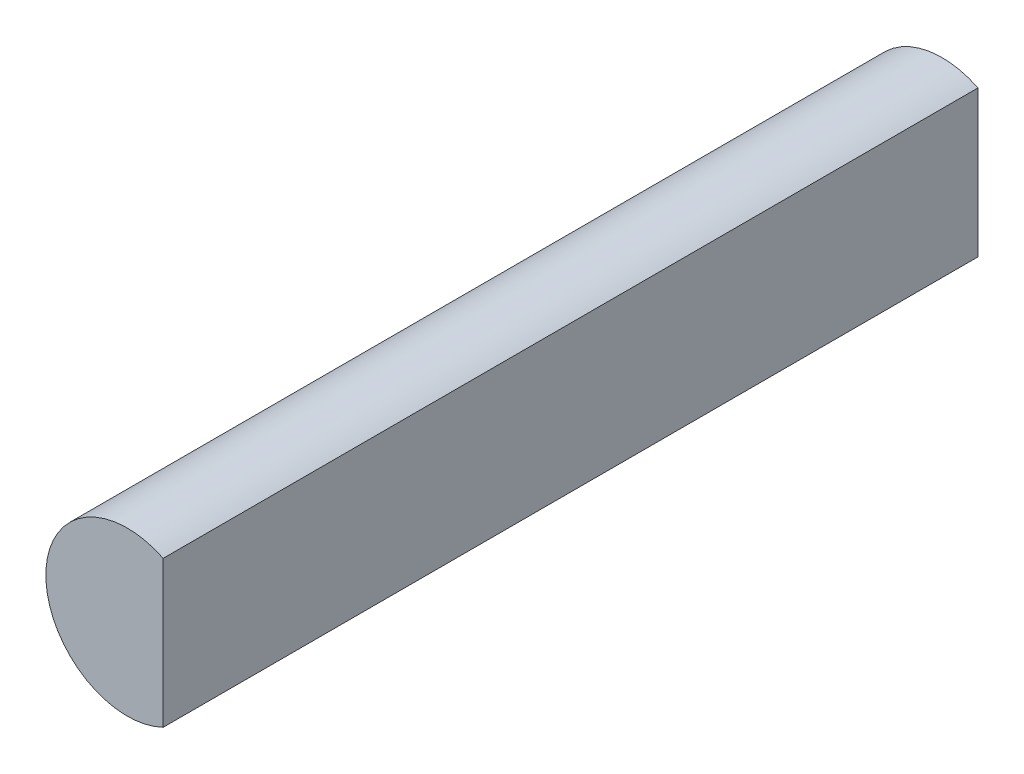
ISO-10303-21;
HEADER;
FILE_DESCRIPTION(('STEP AP214'),'2;1');
FILE_NAME('part.step','',(''),(''),'','','');
FILE_SCHEMA(('AUTOMOTIVE_DESIGN { 1 0 10303 214 1 1 1 1 }'));
ENDSEC;
DATA;
#1=APPLICATION_CONTEXT('core data for automotive mechanical design processes');
#2=APPLICATION_PROTOCOL_DEFINITION('international standard','automotive_design',2000,#1);
#3=PRODUCT_CONTEXT('',#1,'mechanical');
#4=PRODUCT('Part','Part','',(#3));
#5=PRODUCT_RELATED_PRODUCT_CATEGORY('part','',(#4));
#6=PRODUCT_DEFINITION_FORMATION('','',#4);
#7=PRODUCT_DEFINITION_CONTEXT('part definition',#1,'design');
#8=PRODUCT_DEFINITION('design','',#6,#7);
#9=PRODUCT_DEFINITION_SHAPE('','',#8);
#10=(LENGTH_UNIT() NAMED_UNIT(*) SI_UNIT(.MILLI.,.METRE.));
#11=(NAMED_UNIT(*) PLANE_ANGLE_UNIT() SI_UNIT($,.RADIAN.));
#12=(NAMED_UNIT(*) SI_UNIT($,.STERADIAN.) SOLID_ANGLE_UNIT());
#13=UNCERTAINTY_MEASURE_WITH_UNIT(LENGTH_MEASURE(1.E-05),#10,'distance_accuracy_value','');
#14=(GEOMETRIC_REPRESENTATION_CONTEXT(3) GLOBAL_UNCERTAINTY_ASSIGNED_CONTEXT((#13)) GLOBAL_UNIT_ASSIGNED_CONTEXT((#10,
#11,#12)) REPRESENTATION_CONTEXT('',''));
#15=CARTESIAN_POINT('',(0.,0.,0.));
#16=DIRECTION('',(0.,0.,1.));
#17=DIRECTION('',(1.,0.,0.));
#18=AXIS2_PLACEMENT_3D('',#15,#16,#17);
#19=CARTESIAN_POINT('',(0.,0.,10.));
#20=DIRECTION('',(0.,0.,-1.));
#21=DIRECTION('',(-1.,0.,0.));
#22=AXIS2_PLACEMENT_3D('',#19,#20,#21);
#23=CYLINDRICAL_SURFACE('',#22,1.);
#24=CARTESIAN_POINT('',(0.,0.,0.));
#25=DIRECTION('',(0.,0.,1.));
#26=DIRECTION('',(1.,0.,0.));
#27=AXIS2_PLACEMENT_3D('',#24,#25,#26);
#28=CIRCLE('',#27,1.);
#29=CARTESIAN_POINT('',(0.44,0.897997772825746,0.));
#30=VERTEX_POINT('',#29);
#31=CARTESIAN_POINT('',(0.44,-0.897997772825746,0.));
#32=VERTEX_POINT('',#31);
#33=EDGE_CURVE('E70',#30,#32,#28,.T.);
#34=ORIENTED_EDGE('',*,*,#33,.T.);
#35=DIRECTION('',(0.,0.,-1.));
#36=VECTOR('',#35,1.);
#37=CARTESIAN_POINT('',(0.44,-0.897997772825746,10.));
#38=LINE('',#37,#36);
#39=CARTESIAN_POINT('',(0.44,-0.897997772825746,10.));
#40=VERTEX_POINT('',#39);
#41=EDGE_CURVE('E11',#40,#32,#38,.T.);
#42=ORIENTED_EDGE('',*,*,#41,.F.);
#43=CARTESIAN_POINT('',(0.,0.,10.));
#44=DIRECTION('',(0.,0.,1.));
#45=DIRECTION('',(1.,0.,0.));
#46=AXIS2_PLACEMENT_3D('',#43,#44,#45);
#47=CIRCLE('',#46,1.);
#48=CARTESIAN_POINT('',(0.44,0.897997772825746,10.));
#49=VERTEX_POINT('',#48);
#50=EDGE_CURVE('E69',#49,#40,#47,.T.);
#51=ORIENTED_EDGE('',*,*,#50,.F.);
#52=DIRECTION('',(0.,0.,-1.));
#53=VECTOR('',#52,1.);
#54=CARTESIAN_POINT('',(0.44,0.897997772825746,10.));
#55=LINE('',#54,#53);
#56=EDGE_CURVE('E47',#49,#30,#55,.T.);
#57=ORIENTED_EDGE('',*,*,#56,.T.);
#58=EDGE_LOOP('',(#34,#42,#51,#57));
#59=FACE_BOUND('',#58,.T.);
#60=ADVANCED_FACE('F39',(#59),#23,.T.);
#61=CARTESIAN_POINT('',(0.44,0.897997772825746,10.));
#62=DIRECTION('',(-1.,0.,0.));
#63=DIRECTION('',(0.,0.,1.));
#64=AXIS2_PLACEMENT_3D('',#61,#62,#63);
#65=PLANE('',#64);
#66=DIRECTION('',(0.,1.,0.));
#67=VECTOR('',#66,1.);
#68=CARTESIAN_POINT('',(0.44,0.897997772825746,0.));
#69=LINE('',#68,#67);
#70=EDGE_CURVE('E62',#32,#30,#69,.T.);
#71=ORIENTED_EDGE('',*,*,#70,.T.);
#72=ORIENTED_EDGE('',*,*,#56,.F.);
#73=DIRECTION('',(0.,1.,0.));
#74=VECTOR('',#73,1.);
#75=CARTESIAN_POINT('',(0.44,0.897997772825746,10.));
#76=LINE('',#75,#74);
#77=EDGE_CURVE('E54',#40,#49,#76,.T.);
#78=ORIENTED_EDGE('',*,*,#77,.F.);
#79=ORIENTED_EDGE('',*,*,#41,.T.);
#80=EDGE_LOOP('',(#71,#72,#78,#79));
#81=FACE_BOUND('',#80,.T.);
#82=ADVANCED_FACE('F65',(#81),#65,.F.);
#83=CARTESIAN_POINT('',(0.,0.,10.));
#84=DIRECTION('',(0.,0.,1.));
#85=DIRECTION('',(1.,0.,0.));
#86=AXIS2_PLACEMENT_3D('',#83,#84,#85);
#87=PLANE('',#86);
#88=ORIENTED_EDGE('',*,*,#50,.T.);
#89=ORIENTED_EDGE('',*,*,#77,.T.);
#90=EDGE_LOOP('',(#88,#89));
#91=FACE_BOUND('',#90,.T.);
#92=ADVANCED_FACE('F77',(#91),#87,.T.);
#93=CARTESIAN_POINT('',(0.,0.,0.));
#94=DIRECTION('',(0.,0.,1.));
#95=DIRECTION('',(1.,0.,0.));
#96=AXIS2_PLACEMENT_3D('',#93,#94,#95);
#97=PLANE('',#96);
#98=ORIENTED_EDGE('',*,*,#33,.F.);
#99=ORIENTED_EDGE('',*,*,#70,.F.);
#100=EDGE_LOOP('',(#98,#99));
#101=FACE_BOUND('',#100,.T.);
#102=ADVANCED_FACE('F73',(#101),#97,.F.);
#103=CLOSED_SHELL('',(#60,#82,#92,#102));
#104=MANIFOLD_SOLID_BREP('B2',#103);
#105=ADVANCED_BREP_SHAPE_REPRESENTATION('',(#18,#104),#14);
#106=SHAPE_DEFINITION_REPRESENTATION(#9,#105);
ENDSEC;
END-ISO-10303-21;
